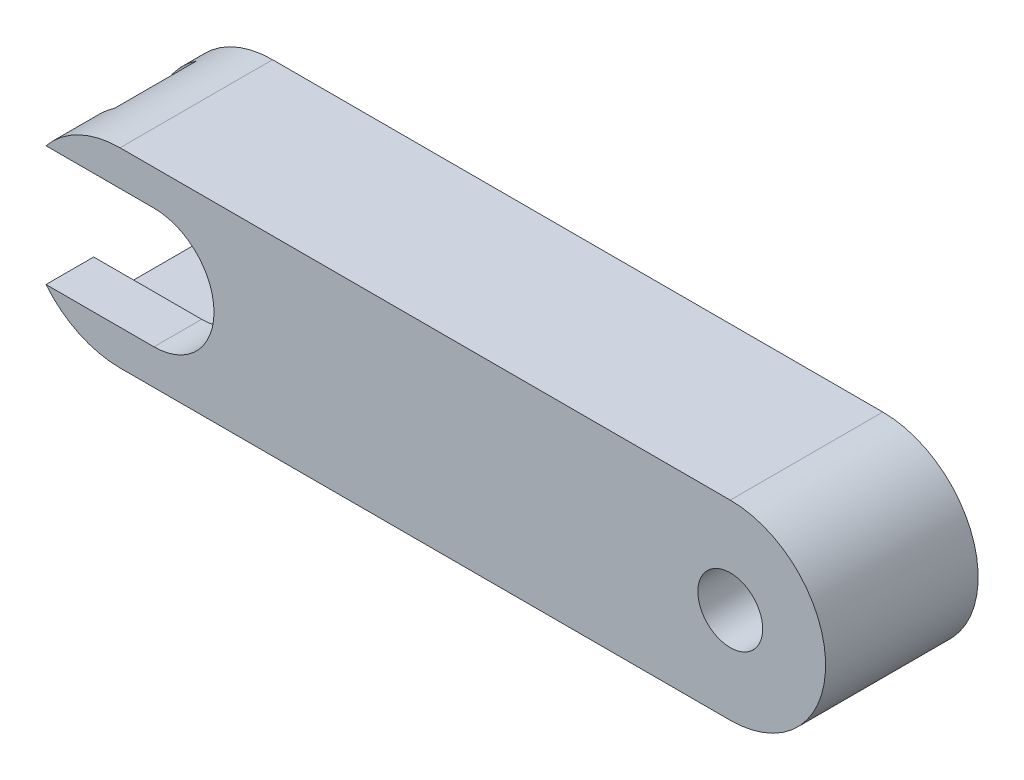
ISO-10303-21;
HEADER;
FILE_DESCRIPTION(('STEP AP214'),'2;1');
FILE_NAME('part.step','',(''),(''),'','','');
FILE_SCHEMA(('AUTOMOTIVE_DESIGN { 1 0 10303 214 1 1 1 1 }'));
ENDSEC;
DATA;
#1=APPLICATION_CONTEXT('core data for automotive mechanical design processes');
#2=APPLICATION_PROTOCOL_DEFINITION('international standard','automotive_design',2000,#1);
#3=PRODUCT_CONTEXT('',#1,'mechanical');
#4=PRODUCT('Part','Part','',(#3));
#5=PRODUCT_RELATED_PRODUCT_CATEGORY('part','',(#4));
#6=PRODUCT_DEFINITION_FORMATION('','',#4);
#7=PRODUCT_DEFINITION_CONTEXT('part definition',#1,'design');
#8=PRODUCT_DEFINITION('design','',#6,#7);
#9=PRODUCT_DEFINITION_SHAPE('','',#8);
#10=(LENGTH_UNIT() NAMED_UNIT(*) SI_UNIT(.MILLI.,.METRE.));
#11=(NAMED_UNIT(*) PLANE_ANGLE_UNIT() SI_UNIT($,.RADIAN.));
#12=(NAMED_UNIT(*) SI_UNIT($,.STERADIAN.) SOLID_ANGLE_UNIT());
#13=UNCERTAINTY_MEASURE_WITH_UNIT(LENGTH_MEASURE(1.E-05),#10,'distance_accuracy_value','');
#14=(GEOMETRIC_REPRESENTATION_CONTEXT(3) GLOBAL_UNCERTAINTY_ASSIGNED_CONTEXT((#13)) GLOBAL_UNIT_ASSIGNED_CONTEXT((#10,
#11,#12)) REPRESENTATION_CONTEXT('',''));
#15=CARTESIAN_POINT('',(0.,0.,0.));
#16=DIRECTION('',(0.,0.,1.));
#17=DIRECTION('',(1.,0.,0.));
#18=AXIS2_PLACEMENT_3D('',#15,#16,#17);
#19=CARTESIAN_POINT('',(-14.2222,0.,8.));
#20=DIRECTION('',(0.,0.,-1.));
#21=DIRECTION('',(-1.,0.,0.));
#22=AXIS2_PLACEMENT_3D('',#19,#20,#21);
#23=CYLINDRICAL_SURFACE('',#22,1.7);
#24=CARTESIAN_POINT('',(-14.2222,0.,0.));
#25=DIRECTION('',(0.,0.,1.));
#26=DIRECTION('',(1.,0.,0.));
#27=AXIS2_PLACEMENT_3D('',#24,#25,#26);
#28=CIRCLE('',#27,1.7);
#29=CARTESIAN_POINT('',(-12.5222,0.,0.));
#30=VERTEX_POINT('',#29);
#31=EDGE_CURVE('E221',#30,#30,#28,.T.);
#32=ORIENTED_EDGE('',*,*,#31,.F.);
#33=EDGE_LOOP('',(#32));
#34=FACE_BOUND('',#33,.T.);
#35=CARTESIAN_POINT('',(-14.2222,0.,1.2));
#36=DIRECTION('',(0.,0.,1.));
#37=DIRECTION('',(1.,0.,0.));
#38=AXIS2_PLACEMENT_3D('',#35,#36,#37);
#39=CIRCLE('',#38,1.7);
#40=CARTESIAN_POINT('',(-12.5222,0.,1.2));
#41=VERTEX_POINT('',#40);
#42=EDGE_CURVE('E186',#41,#41,#39,.T.);
#43=ORIENTED_EDGE('',*,*,#42,.T.);
#44=EDGE_LOOP('',(#43));
#45=FACE_BOUND('',#44,.T.);
#46=ADVANCED_FACE('F39',(#34,#45),#23,.F.);
#47=CARTESIAN_POINT('',(-16.,0.,8.));
#48=DIRECTION('',(0.,0.,1.));
#49=DIRECTION('',(1.,0.,0.));
#50=AXIS2_PLACEMENT_3D('',#47,#48,#49);
#51=PLANE('',#50);
#52=DIRECTION('',(-1.,0.,0.));
#53=VECTOR('',#52,1.);
#54=CARTESIAN_POINT('',(-20.2222,3.15,8.));
#55=LINE('',#54,#53);
#56=CARTESIAN_POINT('',(-14.2222,3.15,8.));
#57=VERTEX_POINT('',#56);
#58=CARTESIAN_POINT('',(-19.8829756630708,3.15,8.));
#59=VERTEX_POINT('',#58);
#60=EDGE_CURVE('E195',#57,#59,#55,.T.);
#61=ORIENTED_EDGE('',*,*,#60,.F.);
#62=CARTESIAN_POINT('',(-14.2222,0.,8.));
#63=DIRECTION('',(0.,0.,1.));
#64=DIRECTION('',(1.,0.,0.));
#65=AXIS2_PLACEMENT_3D('',#62,#63,#64);
#66=CIRCLE('',#65,3.15);
#67=CARTESIAN_POINT('',(-14.2222,-3.15,8.));
#68=VERTEX_POINT('',#67);
#69=EDGE_CURVE('E204',#68,#57,#66,.T.);
#70=ORIENTED_EDGE('',*,*,#69,.F.);
#71=DIRECTION('',(1.,0.,0.));
#72=VECTOR('',#71,1.);
#73=CARTESIAN_POINT('',(-20.2222,-3.15,8.));
#74=LINE('',#73,#72);
#75=CARTESIAN_POINT('',(-19.8829756630708,-3.15,8.));
#76=VERTEX_POINT('',#75);
#77=EDGE_CURVE('E190',#76,#68,#74,.T.);
#78=ORIENTED_EDGE('',*,*,#77,.F.);
#79=CARTESIAN_POINT('',(-16.,0.,8.));
#80=DIRECTION('',(0.,0.,1.));
#81=DIRECTION('',(1.,0.,0.));
#82=AXIS2_PLACEMENT_3D('',#79,#80,#81);
#83=CIRCLE('',#82,5.);
#84=CARTESIAN_POINT('',(-16.,-5.,8.));
#85=VERTEX_POINT('',#84);
#86=EDGE_CURVE('E88',#76,#85,#83,.T.);
#87=ORIENTED_EDGE('',*,*,#86,.T.);
#88=DIRECTION('',(1.,0.,0.));
#89=VECTOR('',#88,1.);
#90=CARTESIAN_POINT('',(-16.,-5.,8.));
#91=LINE('',#90,#89);
#92=CARTESIAN_POINT('',(16.,-4.99999999999999,8.));
#93=VERTEX_POINT('',#92);
#94=EDGE_CURVE('E232',#85,#93,#91,.T.);
#95=ORIENTED_EDGE('',*,*,#94,.T.);
#96=CARTESIAN_POINT('',(16.,0.,8.));
#97=DIRECTION('',(0.,0.,1.));
#98=DIRECTION('',(1.,0.,0.));
#99=AXIS2_PLACEMENT_3D('',#96,#97,#98);
#100=CIRCLE('',#99,5.);
#101=CARTESIAN_POINT('',(16.,5.00000000000001,8.));
#102=VERTEX_POINT('',#101);
#103=EDGE_CURVE('E235',#93,#102,#100,.T.);
#104=ORIENTED_EDGE('',*,*,#103,.T.);
#105=DIRECTION('',(-1.,0.,0.));
#106=VECTOR('',#105,1.);
#107=CARTESIAN_POINT('',(-16.,5.,8.));
#108=LINE('',#107,#106);
#109=CARTESIAN_POINT('',(-16.,5.,8.));
#110=VERTEX_POINT('',#109);
#111=EDGE_CURVE('E57',#102,#110,#108,.T.);
#112=ORIENTED_EDGE('',*,*,#111,.T.);
#113=EDGE_CURVE('E229',#110,#59,#83,.T.);
#114=ORIENTED_EDGE('',*,*,#113,.T.);
#115=EDGE_LOOP('',(#61,#70,#78,#87,#95,#104,#112,#114));
#116=FACE_BOUND('',#115,.T.);
#117=CARTESIAN_POINT('',(16.,0.,8.));
#118=DIRECTION('',(0.,0.,1.));
#119=DIRECTION('',(1.,0.,0.));
#120=AXIS2_PLACEMENT_3D('',#117,#118,#119);
#121=CIRCLE('',#120,1.7);
#122=CARTESIAN_POINT('',(17.7,0.,8.));
#123=VERTEX_POINT('',#122);
#124=EDGE_CURVE('E217',#123,#123,#121,.T.);
#125=ORIENTED_EDGE('',*,*,#124,.F.);
#126=EDGE_LOOP('',(#125));
#127=FACE_BOUND('',#126,.T.);
#128=ADVANCED_FACE('F288',(#116,#127),#51,.T.);
#129=CARTESIAN_POINT('',(-16.,0.,0.));
#130=DIRECTION('',(0.,0.,1.));
#131=DIRECTION('',(1.,0.,0.));
#132=AXIS2_PLACEMENT_3D('',#129,#130,#131);
#133=PLANE('',#132);
#134=CARTESIAN_POINT('',(-16.,0.,0.));
#135=DIRECTION('',(0.,0.,1.));
#136=DIRECTION('',(1.,0.,0.));
#137=AXIS2_PLACEMENT_3D('',#134,#135,#136);
#138=CIRCLE('',#137,5.);
#139=CARTESIAN_POINT('',(-16.,5.,0.));
#140=VERTEX_POINT('',#139);
#141=CARTESIAN_POINT('',(-16.,-5.,0.));
#142=VERTEX_POINT('',#141);
#143=EDGE_CURVE('E228',#140,#142,#138,.T.);
#144=ORIENTED_EDGE('',*,*,#143,.F.);
#145=DIRECTION('',(-1.,0.,0.));
#146=VECTOR('',#145,1.);
#147=CARTESIAN_POINT('',(-16.,5.,0.));
#148=LINE('',#147,#146);
#149=CARTESIAN_POINT('',(16.,5.00000000000001,0.));
#150=VERTEX_POINT('',#149);
#151=EDGE_CURVE('E81',#150,#140,#148,.T.);
#152=ORIENTED_EDGE('',*,*,#151,.F.);
#153=CARTESIAN_POINT('',(16.,0.,0.));
#154=DIRECTION('',(0.,0.,1.));
#155=DIRECTION('',(1.,0.,0.));
#156=AXIS2_PLACEMENT_3D('',#153,#154,#155);
#157=CIRCLE('',#156,5.);
#158=CARTESIAN_POINT('',(16.,-4.99999999999999,0.));
#159=VERTEX_POINT('',#158);
#160=EDGE_CURVE('E75',#159,#150,#157,.T.);
#161=ORIENTED_EDGE('',*,*,#160,.F.);
#162=DIRECTION('',(1.,0.,0.));
#163=VECTOR('',#162,1.);
#164=CARTESIAN_POINT('',(-16.,-5.,0.));
#165=LINE('',#164,#163);
#166=EDGE_CURVE('E244',#142,#159,#165,.T.);
#167=ORIENTED_EDGE('',*,*,#166,.F.);
#168=EDGE_LOOP('',(#144,#152,#161,#167));
#169=FACE_BOUND('',#168,.T.);
#170=ORIENTED_EDGE('',*,*,#31,.T.);
#171=EDGE_LOOP('',(#170));
#172=FACE_BOUND('',#171,.T.);
#173=CARTESIAN_POINT('',(16.,0.,0.));
#174=DIRECTION('',(0.,0.,1.));
#175=DIRECTION('',(1.,0.,0.));
#176=AXIS2_PLACEMENT_3D('',#173,#174,#175);
#177=CIRCLE('',#176,1.7);
#178=CARTESIAN_POINT('',(17.7,0.,0.));
#179=VERTEX_POINT('',#178);
#180=EDGE_CURVE('E213',#179,#179,#177,.T.);
#181=ORIENTED_EDGE('',*,*,#180,.T.);
#182=EDGE_LOOP('',(#181));
#183=FACE_BOUND('',#182,.T.);
#184=ADVANCED_FACE('F293',(#169,#172,#183),#133,.F.);
#185=CARTESIAN_POINT('',(-16.,0.,8.));
#186=DIRECTION('',(0.,0.,-1.));
#187=DIRECTION('',(-1.,0.,0.));
#188=AXIS2_PLACEMENT_3D('',#185,#186,#187);
#189=CYLINDRICAL_SURFACE('',#188,5.);
#190=DIRECTION('',(0.,0.,-1.));
#191=VECTOR('',#190,1.);
#192=CARTESIAN_POINT('',(-18.7888169534769,4.15,8.));
#193=LINE('',#192,#191);
#194=CARTESIAN_POINT('',(-18.7888169534769,4.15,1.2));
#195=VERTEX_POINT('',#194);
#196=CARTESIAN_POINT('',(-18.7888169534769,4.15,5.5));
#197=VERTEX_POINT('',#196);
#198=EDGE_CURVE('E11',#195,#197,#193,.F.);
#199=ORIENTED_EDGE('',*,*,#198,.T.);
#200=CARTESIAN_POINT('',(-16.,0.,5.5));
#201=DIRECTION('',(0.,0.,1.));
#202=DIRECTION('',(1.,0.,0.));
#203=AXIS2_PLACEMENT_3D('',#200,#201,#202);
#204=CIRCLE('',#203,5.);
#205=CARTESIAN_POINT('',(-19.8829756630708,3.15,5.5));
#206=VERTEX_POINT('',#205);
#207=EDGE_CURVE('E185',#197,#206,#204,.T.);
#208=ORIENTED_EDGE('',*,*,#207,.T.);
#209=DIRECTION('',(0.,0.,-1.));
#210=VECTOR('',#209,1.);
#211=CARTESIAN_POINT('',(-19.8829756630708,3.15,8.));
#212=LINE('',#211,#210);
#213=EDGE_CURVE('E267',#206,#59,#212,.F.);
#214=ORIENTED_EDGE('',*,*,#213,.T.);
#215=ORIENTED_EDGE('',*,*,#113,.F.);
#216=DIRECTION('',(0.,0.,-1.));
#217=VECTOR('',#216,1.);
#218=CARTESIAN_POINT('',(-16.,5.,8.));
#219=LINE('',#218,#217);
#220=EDGE_CURVE('E240',#110,#140,#219,.T.);
#221=ORIENTED_EDGE('',*,*,#220,.T.);
#222=ORIENTED_EDGE('',*,*,#143,.T.);
#223=DIRECTION('',(0.,0.,-1.));
#224=VECTOR('',#223,1.);
#225=CARTESIAN_POINT('',(-16.,-5.,8.));
#226=LINE('',#225,#224);
#227=EDGE_CURVE('E259',#85,#142,#226,.T.);
#228=ORIENTED_EDGE('',*,*,#227,.F.);
#229=ORIENTED_EDGE('',*,*,#86,.F.);
#230=DIRECTION('',(0.,0.,-1.));
#231=VECTOR('',#230,1.);
#232=CARTESIAN_POINT('',(-19.8829756630708,-3.15,8.));
#233=LINE('',#232,#231);
#234=CARTESIAN_POINT('',(-19.8829756630708,-3.15,5.5));
#235=VERTEX_POINT('',#234);
#236=EDGE_CURVE('E263',#76,#235,#233,.T.);
#237=ORIENTED_EDGE('',*,*,#236,.T.);
#238=CARTESIAN_POINT('',(-18.7888169534769,-4.15,5.5));
#239=VERTEX_POINT('',#238);
#240=EDGE_CURVE('E180',#235,#239,#204,.T.);
#241=ORIENTED_EDGE('',*,*,#240,.T.);
#242=DIRECTION('',(0.,0.,-1.));
#243=VECTOR('',#242,1.);
#244=CARTESIAN_POINT('',(-18.7888169534769,-4.15,8.));
#245=LINE('',#244,#243);
#246=CARTESIAN_POINT('',(-18.7888169534769,-4.15,1.2));
#247=VERTEX_POINT('',#246);
#248=EDGE_CURVE('E271',#239,#247,#245,.T.);
#249=ORIENTED_EDGE('',*,*,#248,.T.);
#250=CARTESIAN_POINT('',(-16.,0.,1.2));
#251=DIRECTION('',(0.,0.,1.));
#252=DIRECTION('',(1.,0.,0.));
#253=AXIS2_PLACEMENT_3D('',#250,#251,#252);
#254=CIRCLE('',#253,5.);
#255=EDGE_CURVE('E49',#195,#247,#254,.T.);
#256=ORIENTED_EDGE('',*,*,#255,.F.);
#257=EDGE_LOOP('',(#199,#208,#214,#215,#221,#222,#228,#229,#237,#241,#249,#256));
#258=FACE_BOUND('',#257,.T.);
#259=ADVANCED_FACE('F41',(#258),#189,.T.);
#260=CARTESIAN_POINT('',(-16.,-5.,8.));
#261=DIRECTION('',(0.,1.,0.));
#262=DIRECTION('',(-1.,0.,0.));
#263=AXIS2_PLACEMENT_3D('',#260,#261,#262);
#264=PLANE('',#263);
#265=ORIENTED_EDGE('',*,*,#166,.T.);
#266=DIRECTION('',(0.,0.,-1.));
#267=VECTOR('',#266,1.);
#268=CARTESIAN_POINT('',(16.,-4.99999999999999,8.));
#269=LINE('',#268,#267);
#270=EDGE_CURVE('E256',#93,#159,#269,.T.);
#271=ORIENTED_EDGE('',*,*,#270,.F.);
#272=ORIENTED_EDGE('',*,*,#94,.F.);
#273=ORIENTED_EDGE('',*,*,#227,.T.);
#274=EDGE_LOOP('',(#265,#271,#272,#273));
#275=FACE_BOUND('',#274,.T.);
#276=ADVANCED_FACE('F297',(#275),#264,.F.);
#277=CARTESIAN_POINT('',(16.,0.,8.));
#278=DIRECTION('',(0.,0.,-1.));
#279=DIRECTION('',(-1.,0.,0.));
#280=AXIS2_PLACEMENT_3D('',#277,#278,#279);
#281=CYLINDRICAL_SURFACE('',#280,5.);
#282=ORIENTED_EDGE('',*,*,#160,.T.);
#283=DIRECTION('',(0.,0.,-1.));
#284=VECTOR('',#283,1.);
#285=CARTESIAN_POINT('',(16.,5.00000000000001,8.));
#286=LINE('',#285,#284);
#287=EDGE_CURVE('E253',#102,#150,#286,.T.);
#288=ORIENTED_EDGE('',*,*,#287,.F.);
#289=ORIENTED_EDGE('',*,*,#103,.F.);
#290=ORIENTED_EDGE('',*,*,#270,.T.);
#291=EDGE_LOOP('',(#282,#288,#289,#290));
#292=FACE_BOUND('',#291,.T.);
#293=ADVANCED_FACE('F336',(#292),#281,.T.);
#294=CARTESIAN_POINT('',(-16.,5.,8.));
#295=DIRECTION('',(0.,-1.,0.));
#296=DIRECTION('',(1.,0.,0.));
#297=AXIS2_PLACEMENT_3D('',#294,#295,#296);
#298=PLANE('',#297);
#299=ORIENTED_EDGE('',*,*,#151,.T.);
#300=ORIENTED_EDGE('',*,*,#220,.F.);
#301=ORIENTED_EDGE('',*,*,#111,.F.);
#302=ORIENTED_EDGE('',*,*,#287,.T.);
#303=EDGE_LOOP('',(#299,#300,#301,#302));
#304=FACE_BOUND('',#303,.T.);
#305=ADVANCED_FACE('F333',(#304),#298,.F.);
#306=CARTESIAN_POINT('',(16.,0.,8.));
#307=DIRECTION('',(0.,0.,-1.));
#308=DIRECTION('',(-1.,0.,0.));
#309=AXIS2_PLACEMENT_3D('',#306,#307,#308);
#310=CYLINDRICAL_SURFACE('',#309,1.7);
#311=ORIENTED_EDGE('',*,*,#124,.T.);
#312=EDGE_LOOP('',(#311));
#313=FACE_BOUND('',#312,.T.);
#314=ORIENTED_EDGE('',*,*,#180,.F.);
#315=EDGE_LOOP('',(#314));
#316=FACE_BOUND('',#315,.T.);
#317=ADVANCED_FACE('F328',(#313,#316),#310,.F.);
#318=CARTESIAN_POINT('',(-20.2222,3.15,5.5));
#319=DIRECTION('',(0.,1.,0.));
#320=DIRECTION('',(0.,0.,1.));
#321=AXIS2_PLACEMENT_3D('',#318,#319,#320);
#322=PLANE('',#321);
#323=DIRECTION('',(-1.,0.,0.));
#324=VECTOR('',#323,1.);
#325=CARTESIAN_POINT('',(-20.2222,3.15,5.5));
#326=LINE('',#325,#324);
#327=CARTESIAN_POINT('',(-14.2222,3.15,5.5));
#328=VERTEX_POINT('',#327);
#329=EDGE_CURVE('E198',#328,#206,#326,.T.);
#330=ORIENTED_EDGE('',*,*,#329,.F.);
#331=DIRECTION('',(0.,0.,1.));
#332=VECTOR('',#331,1.);
#333=CARTESIAN_POINT('',(-14.2222,3.15,5.5));
#334=LINE('',#333,#332);
#335=EDGE_CURVE('E210',#328,#57,#334,.T.);
#336=ORIENTED_EDGE('',*,*,#335,.T.);
#337=ORIENTED_EDGE('',*,*,#60,.T.);
#338=ORIENTED_EDGE('',*,*,#213,.F.);
#339=EDGE_LOOP('',(#330,#336,#337,#338));
#340=FACE_BOUND('',#339,.T.);
#341=ADVANCED_FACE('F284',(#340),#322,.F.);
#342=CARTESIAN_POINT('',(-20.2222,-3.15,5.5));
#343=DIRECTION('',(0.,-1.,0.));
#344=DIRECTION('',(0.,0.,-1.));
#345=AXIS2_PLACEMENT_3D('',#342,#343,#344);
#346=PLANE('',#345);
#347=ORIENTED_EDGE('',*,*,#77,.T.);
#348=DIRECTION('',(0.,0.,1.));
#349=VECTOR('',#348,1.);
#350=CARTESIAN_POINT('',(-14.2222,-3.15,5.5));
#351=LINE('',#350,#349);
#352=CARTESIAN_POINT('',(-14.2222,-3.15,5.5));
#353=VERTEX_POINT('',#352);
#354=EDGE_CURVE('E201',#353,#68,#351,.T.);
#355=ORIENTED_EDGE('',*,*,#354,.F.);
#356=DIRECTION('',(1.,0.,0.));
#357=VECTOR('',#356,1.);
#358=CARTESIAN_POINT('',(-20.2222,-3.15,5.5));
#359=LINE('',#358,#357);
#360=EDGE_CURVE('E191',#235,#353,#359,.T.);
#361=ORIENTED_EDGE('',*,*,#360,.F.);
#362=ORIENTED_EDGE('',*,*,#236,.F.);
#363=EDGE_LOOP('',(#347,#355,#361,#362));
#364=FACE_BOUND('',#363,.T.);
#365=ADVANCED_FACE('F300',(#364),#346,.F.);
#366=CARTESIAN_POINT('',(-14.2222,0.,5.5));
#367=DIRECTION('',(0.,0.,1.));
#368=DIRECTION('',(1.,0.,0.));
#369=AXIS2_PLACEMENT_3D('',#366,#367,#368);
#370=CYLINDRICAL_SURFACE('',#369,3.15);
#371=ORIENTED_EDGE('',*,*,#69,.T.);
#372=ORIENTED_EDGE('',*,*,#335,.F.);
#373=CARTESIAN_POINT('',(-14.2222,0.,5.5));
#374=DIRECTION('',(0.,0.,1.));
#375=DIRECTION('',(1.,0.,0.));
#376=AXIS2_PLACEMENT_3D('',#373,#374,#375);
#377=CIRCLE('',#376,3.15);
#378=EDGE_CURVE('E194',#353,#328,#377,.T.);
#379=ORIENTED_EDGE('',*,*,#378,.F.);
#380=ORIENTED_EDGE('',*,*,#354,.T.);
#381=EDGE_LOOP('',(#371,#372,#379,#380));
#382=FACE_BOUND('',#381,.T.);
#383=ADVANCED_FACE('F307',(#382),#370,.F.);
#384=CARTESIAN_POINT('',(-21.,4.15,1.2));
#385=DIRECTION('',(0.,1.,0.));
#386=DIRECTION('',(0.,0.,1.));
#387=AXIS2_PLACEMENT_3D('',#384,#385,#386);
#388=PLANE('',#387);
#389=DIRECTION('',(-1.,0.,0.));
#390=VECTOR('',#389,1.);
#391=CARTESIAN_POINT('',(-21.,4.15,1.2));
#392=LINE('',#391,#390);
#393=CARTESIAN_POINT('',(-14.2222,4.15,1.2));
#394=VERTEX_POINT('',#393);
#395=EDGE_CURVE('E163',#394,#195,#392,.T.);
#396=ORIENTED_EDGE('',*,*,#395,.F.);
#397=DIRECTION('',(0.,0.,1.));
#398=VECTOR('',#397,1.);
#399=CARTESIAN_POINT('',(-14.2222,4.15,1.2));
#400=LINE('',#399,#398);
#401=CARTESIAN_POINT('',(-14.2222,4.15,5.5));
#402=VERTEX_POINT('',#401);
#403=EDGE_CURVE('E162',#394,#402,#400,.T.);
#404=ORIENTED_EDGE('',*,*,#403,.T.);
#405=DIRECTION('',(-1.,0.,0.));
#406=VECTOR('',#405,1.);
#407=CARTESIAN_POINT('',(-21.,4.15,5.5));
#408=LINE('',#407,#406);
#409=EDGE_CURVE('E151',#402,#197,#408,.T.);
#410=ORIENTED_EDGE('',*,*,#409,.T.);
#411=ORIENTED_EDGE('',*,*,#198,.F.);
#412=EDGE_LOOP('',(#396,#404,#410,#411));
#413=FACE_BOUND('',#412,.T.);
#414=ADVANCED_FACE('F305',(#413),#388,.F.);
#415=CARTESIAN_POINT('',(-21.,-4.15,1.2));
#416=DIRECTION('',(0.,-1.,0.));
#417=DIRECTION('',(0.,0.,-1.));
#418=AXIS2_PLACEMENT_3D('',#415,#416,#417);
#419=PLANE('',#418);
#420=DIRECTION('',(1.,0.,0.));
#421=VECTOR('',#420,1.);
#422=CARTESIAN_POINT('',(-21.,-4.15,5.5));
#423=LINE('',#422,#421);
#424=CARTESIAN_POINT('',(-14.2222,-4.15,5.5));
#425=VERTEX_POINT('',#424);
#426=EDGE_CURVE('E157',#239,#425,#423,.T.);
#427=ORIENTED_EDGE('',*,*,#426,.T.);
#428=DIRECTION('',(0.,0.,1.));
#429=VECTOR('',#428,1.);
#430=CARTESIAN_POINT('',(-14.2222,-4.15,1.2));
#431=LINE('',#430,#429);
#432=CARTESIAN_POINT('',(-14.2222,-4.15,1.2));
#433=VERTEX_POINT('',#432);
#434=EDGE_CURVE('E154',#433,#425,#431,.T.);
#435=ORIENTED_EDGE('',*,*,#434,.F.);
#436=DIRECTION('',(1.,0.,0.));
#437=VECTOR('',#436,1.);
#438=CARTESIAN_POINT('',(-21.,-4.15,1.2));
#439=LINE('',#438,#437);
#440=EDGE_CURVE('E140',#247,#433,#439,.T.);
#441=ORIENTED_EDGE('',*,*,#440,.F.);
#442=ORIENTED_EDGE('',*,*,#248,.F.);
#443=EDGE_LOOP('',(#427,#435,#441,#442));
#444=FACE_BOUND('',#443,.T.);
#445=ADVANCED_FACE('F155',(#444),#419,.F.);
#446=CARTESIAN_POINT('',(-21.,0.,1.2));
#447=DIRECTION('',(0.,0.,1.));
#448=DIRECTION('',(1.,0.,0.));
#449=AXIS2_PLACEMENT_3D('',#446,#447,#448);
#450=PLANE('',#449);
#451=ORIENTED_EDGE('',*,*,#42,.F.);
#452=EDGE_LOOP('',(#451));
#453=FACE_BOUND('',#452,.T.);
#454=ORIENTED_EDGE('',*,*,#255,.T.);
#455=ORIENTED_EDGE('',*,*,#440,.T.);
#456=CARTESIAN_POINT('',(-14.2222,0.,1.2));
#457=DIRECTION('',(0.,0.,1.));
#458=DIRECTION('',(1.,0.,0.));
#459=AXIS2_PLACEMENT_3D('',#456,#457,#458);
#460=CIRCLE('',#459,4.15);
#461=EDGE_CURVE('E145',#433,#394,#460,.T.);
#462=ORIENTED_EDGE('',*,*,#461,.T.);
#463=ORIENTED_EDGE('',*,*,#395,.T.);
#464=EDGE_LOOP('',(#454,#455,#462,#463));
#465=FACE_BOUND('',#464,.T.);
#466=ADVANCED_FACE('F142',(#453,#465),#450,.T.);
#467=CARTESIAN_POINT('',(-21.,0.,5.5));
#468=DIRECTION('',(0.,0.,1.));
#469=DIRECTION('',(1.,0.,0.));
#470=AXIS2_PLACEMENT_3D('',#467,#468,#469);
#471=PLANE('',#470);
#472=ORIENTED_EDGE('',*,*,#409,.F.);
#473=CARTESIAN_POINT('',(-14.2222,0.,5.5));
#474=DIRECTION('',(0.,0.,1.));
#475=DIRECTION('',(1.,0.,0.));
#476=AXIS2_PLACEMENT_3D('',#473,#474,#475);
#477=CIRCLE('',#476,4.15);
#478=EDGE_CURVE('E173',#425,#402,#477,.T.);
#479=ORIENTED_EDGE('',*,*,#478,.F.);
#480=ORIENTED_EDGE('',*,*,#426,.F.);
#481=ORIENTED_EDGE('',*,*,#240,.F.);
#482=ORIENTED_EDGE('',*,*,#360,.T.);
#483=ORIENTED_EDGE('',*,*,#378,.T.);
#484=ORIENTED_EDGE('',*,*,#329,.T.);
#485=ORIENTED_EDGE('',*,*,#207,.F.);
#486=EDGE_LOOP('',(#472,#479,#480,#481,#482,#483,#484,#485));
#487=FACE_BOUND('',#486,.T.);
#488=ADVANCED_FACE('F303',(#487),#471,.F.);
#489=CARTESIAN_POINT('',(-14.2222,0.,1.2));
#490=DIRECTION('',(0.,0.,1.));
#491=DIRECTION('',(1.,0.,0.));
#492=AXIS2_PLACEMENT_3D('',#489,#490,#491);
#493=CYLINDRICAL_SURFACE('',#492,4.15);
#494=ORIENTED_EDGE('',*,*,#478,.T.);
#495=ORIENTED_EDGE('',*,*,#403,.F.);
#496=ORIENTED_EDGE('',*,*,#461,.F.);
#497=ORIENTED_EDGE('',*,*,#434,.T.);
#498=EDGE_LOOP('',(#494,#495,#496,#497));
#499=FACE_BOUND('',#498,.T.);
#500=ADVANCED_FACE('F165',(#499),#493,.F.);
#501=CLOSED_SHELL('',(#46,#128,#184,#259,#276,#293,#305,#317,#341,#365,#383,#414,#445,#466,#488,#500));
#502=MANIFOLD_SOLID_BREP('B2',#501);
#503=ADVANCED_BREP_SHAPE_REPRESENTATION('',(#18,#502),#14);
#504=SHAPE_DEFINITION_REPRESENTATION(#9,#503);
ENDSEC;
END-ISO-10303-21;
